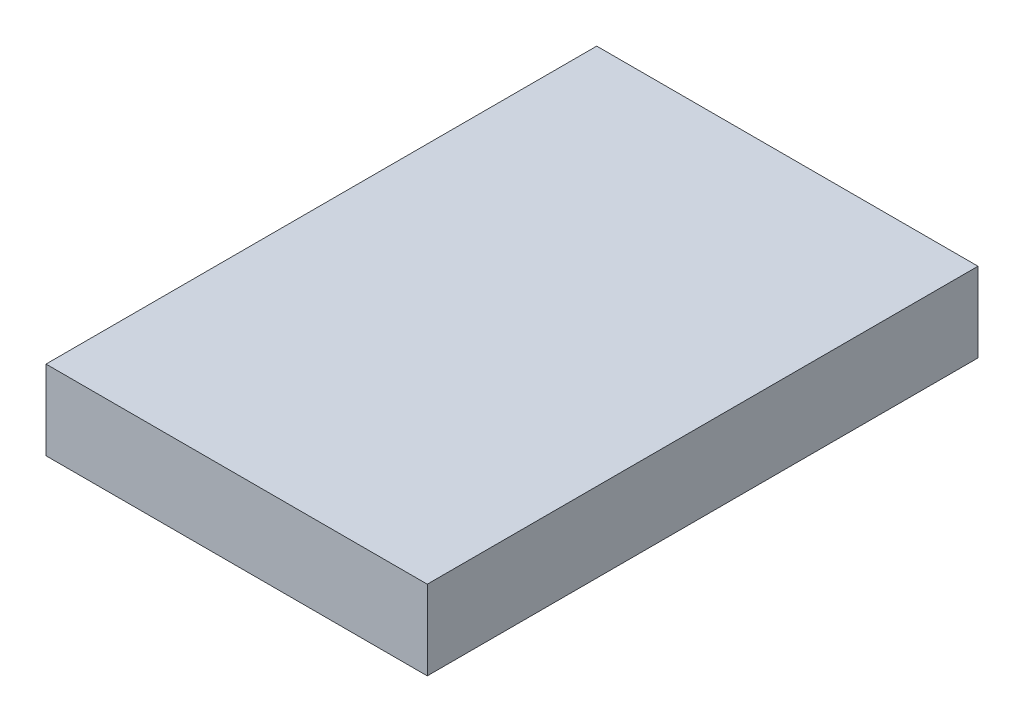
ISO-10303-21;
HEADER;
FILE_DESCRIPTION(('STEP AP214'),'2;1');
FILE_NAME('part.step','',(''),(''),'','','');
FILE_SCHEMA(('AUTOMOTIVE_DESIGN { 1 0 10303 214 1 1 1 1 }'));
ENDSEC;
DATA;
#1=APPLICATION_CONTEXT('core data for automotive mechanical design processes');
#2=APPLICATION_PROTOCOL_DEFINITION('international standard','automotive_design',2000,#1);
#3=PRODUCT_CONTEXT('',#1,'mechanical');
#4=PRODUCT('Part','Part','',(#3));
#5=PRODUCT_RELATED_PRODUCT_CATEGORY('part','',(#4));
#6=PRODUCT_DEFINITION_FORMATION('','',#4);
#7=PRODUCT_DEFINITION_CONTEXT('part definition',#1,'design');
#8=PRODUCT_DEFINITION('design','',#6,#7);
#9=PRODUCT_DEFINITION_SHAPE('','',#8);
#10=(LENGTH_UNIT() NAMED_UNIT(*) SI_UNIT(.MILLI.,.METRE.));
#11=(NAMED_UNIT(*) PLANE_ANGLE_UNIT() SI_UNIT($,.RADIAN.));
#12=(NAMED_UNIT(*) SI_UNIT($,.STERADIAN.) SOLID_ANGLE_UNIT());
#13=UNCERTAINTY_MEASURE_WITH_UNIT(LENGTH_MEASURE(1.E-05),#10,'distance_accuracy_value','');
#14=(GEOMETRIC_REPRESENTATION_CONTEXT(3) GLOBAL_UNCERTAINTY_ASSIGNED_CONTEXT((#13)) GLOBAL_UNIT_ASSIGNED_CONTEXT((#10,
#11,#12)) REPRESENTATION_CONTEXT('',''));
#15=CARTESIAN_POINT('',(0.,0.,0.));
#16=DIRECTION('',(0.,0.,1.));
#17=DIRECTION('',(1.,0.,0.));
#18=AXIS2_PLACEMENT_3D('',#15,#16,#17);
#19=CARTESIAN_POINT('',(-7.19999068,-1.499997,0.));
#20=DIRECTION('',(0.,1.,0.));
#21=DIRECTION('',(0.,0.,1.));
#22=AXIS2_PLACEMENT_3D('',#19,#20,#21);
#23=PLANE('',#22);
#24=DIRECTION('',(0.,0.,1.));
#25=VECTOR('',#24,1.);
#26=CARTESIAN_POINT('',(7.19999322,-1.499997,0.));
#27=LINE('',#26,#25);
#28=CARTESIAN_POINT('',(7.19999322,-1.499997,0.));
#29=VERTEX_POINT('',#28);
#30=CARTESIAN_POINT('',(7.19999322,-1.499997,20.79999904));
#31=VERTEX_POINT('',#30);
#32=EDGE_CURVE('E20',#29,#31,#27,.T.);
#33=ORIENTED_EDGE('',*,*,#32,.T.);
#34=DIRECTION('',(-1.,0.,0.));
#35=VECTOR('',#34,1.);
#36=CARTESIAN_POINT('',(7.19999322,-1.499997,20.79999904));
#37=LINE('',#36,#35);
#38=CARTESIAN_POINT('',(-7.19999068000001,-1.499997,20.79999904));
#39=VERTEX_POINT('',#38);
#40=EDGE_CURVE('E55',#31,#39,#37,.T.);
#41=ORIENTED_EDGE('',*,*,#40,.T.);
#42=DIRECTION('',(0.,0.,1.));
#43=VECTOR('',#42,1.);
#44=CARTESIAN_POINT('',(-7.19999068000003,-1.499997,0.));
#45=LINE('',#44,#43);
#46=CARTESIAN_POINT('',(-7.19999068000001,-1.499997,0.));
#47=VERTEX_POINT('',#46);
#48=EDGE_CURVE('E74',#39,#47,#45,.F.);
#49=ORIENTED_EDGE('',*,*,#48,.T.);
#50=DIRECTION('',(-1.,0.,0.));
#51=VECTOR('',#50,1.);
#52=CARTESIAN_POINT('',(7.19999322,-1.499997,0.));
#53=LINE('',#52,#51);
#54=EDGE_CURVE('E66',#29,#47,#53,.T.);
#55=ORIENTED_EDGE('',*,*,#54,.F.);
#56=EDGE_LOOP('',(#33,#41,#49,#55));
#57=FACE_BOUND('',#56,.T.);
#58=ADVANCED_FACE('F17',(#57),#23,.F.);
#59=CARTESIAN_POINT('',(7.19999322,-1.499997,0.));
#60=DIRECTION('',(-1.,0.,0.));
#61=DIRECTION('',(0.,0.,1.));
#62=AXIS2_PLACEMENT_3D('',#59,#60,#61);
#63=PLANE('',#62);
#64=DIRECTION('',(0.,0.,-1.));
#65=VECTOR('',#64,1.);
#66=CARTESIAN_POINT('',(7.19999322,1.49999954,0.));
#67=LINE('',#66,#65);
#68=CARTESIAN_POINT('',(7.19999322,1.49999954,0.));
#69=VERTEX_POINT('',#68);
#70=CARTESIAN_POINT('',(7.19999322,1.49999954,20.79999904));
#71=VERTEX_POINT('',#70);
#72=EDGE_CURVE('E72',#69,#71,#67,.F.);
#73=ORIENTED_EDGE('',*,*,#72,.T.);
#74=DIRECTION('',(0.,1.,0.));
#75=VECTOR('',#74,1.);
#76=CARTESIAN_POINT('',(7.19999322,-1.499997,20.79999904));
#77=LINE('',#76,#75);
#78=EDGE_CURVE('E62',#71,#31,#77,.F.);
#79=ORIENTED_EDGE('',*,*,#78,.T.);
#80=ORIENTED_EDGE('',*,*,#32,.F.);
#81=DIRECTION('',(0.,1.,0.));
#82=VECTOR('',#81,1.);
#83=CARTESIAN_POINT('',(7.19999322,-1.499997,0.));
#84=LINE('',#83,#82);
#85=EDGE_CURVE('E80',#69,#29,#84,.F.);
#86=ORIENTED_EDGE('',*,*,#85,.F.);
#87=EDGE_LOOP('',(#73,#79,#80,#86));
#88=FACE_BOUND('',#87,.T.);
#89=ADVANCED_FACE('F71',(#88),#63,.F.);
#90=CARTESIAN_POINT('',(7.19999322,-1.499997,20.79999904));
#91=DIRECTION('',(0.,0.,-1.));
#92=DIRECTION('',(-1.,0.,0.));
#93=AXIS2_PLACEMENT_3D('',#90,#91,#92);
#94=PLANE('',#93);
#95=DIRECTION('',(1.,0.,0.));
#96=VECTOR('',#95,1.);
#97=CARTESIAN_POINT('',(7.19999322,1.49999954,20.79999904));
#98=LINE('',#97,#96);
#99=CARTESIAN_POINT('',(-7.19999195,1.49999954,20.79999904));
#100=VERTEX_POINT('',#99);
#101=EDGE_CURVE('E83',#71,#100,#98,.F.);
#102=ORIENTED_EDGE('',*,*,#101,.T.);
#103=DIRECTION('',(-8.46667632681097E-07,0.999999999999642,0.));
#104=VECTOR('',#103,1.);
#105=CARTESIAN_POINT('',(-7.19999322,1.49999954,20.79999904));
#106=LINE('',#105,#104);
#107=EDGE_CURVE('E64',#100,#39,#106,.F.);
#108=ORIENTED_EDGE('',*,*,#107,.T.);
#109=ORIENTED_EDGE('',*,*,#40,.F.);
#110=ORIENTED_EDGE('',*,*,#78,.F.);
#111=EDGE_LOOP('',(#102,#108,#109,#110));
#112=FACE_BOUND('',#111,.T.);
#113=ADVANCED_FACE('F60',(#112),#94,.F.);
#114=CARTESIAN_POINT('',(-7.19999322,1.49999954,0.));
#115=DIRECTION('',(0.999999999999642,8.46667632681097E-07,0.));
#116=DIRECTION('',(-8.46667632681097E-07,0.999999999999642,0.));
#117=AXIS2_PLACEMENT_3D('',#114,#115,#116);
#118=PLANE('',#117);
#119=ORIENTED_EDGE('',*,*,#48,.F.);
#120=ORIENTED_EDGE('',*,*,#107,.F.);
#121=DIRECTION('',(0.,0.,-1.));
#122=VECTOR('',#121,1.);
#123=CARTESIAN_POINT('',(-7.19999322,1.49999954,0.));
#124=LINE('',#123,#122);
#125=CARTESIAN_POINT('',(-7.199992585,1.49999954,0.));
#126=VERTEX_POINT('',#125);
#127=EDGE_CURVE('E26',#100,#126,#124,.T.);
#128=ORIENTED_EDGE('',*,*,#127,.T.);
#129=DIRECTION('',(0.,1.,0.));
#130=VECTOR('',#129,1.);
#131=CARTESIAN_POINT('',(-7.19999068,-1.499997,0.));
#132=LINE('',#131,#130);
#133=EDGE_CURVE('E34',#47,#126,#132,.T.);
#134=ORIENTED_EDGE('',*,*,#133,.F.);
#135=EDGE_LOOP('',(#119,#120,#128,#134));
#136=FACE_BOUND('',#135,.T.);
#137=ADVANCED_FACE('F88',(#136),#118,.F.);
#138=CARTESIAN_POINT('',(7.19999322,-1.499997,0.));
#139=DIRECTION('',(0.,0.,-1.));
#140=DIRECTION('',(-1.,0.,0.));
#141=AXIS2_PLACEMENT_3D('',#138,#139,#140);
#142=PLANE('',#141);
#143=DIRECTION('',(1.,0.,0.));
#144=VECTOR('',#143,1.);
#145=CARTESIAN_POINT('',(7.19999322,1.49999954,0.));
#146=LINE('',#145,#144);
#147=EDGE_CURVE('E11',#126,#69,#146,.T.);
#148=ORIENTED_EDGE('',*,*,#147,.T.);
#149=ORIENTED_EDGE('',*,*,#85,.T.);
#150=ORIENTED_EDGE('',*,*,#54,.T.);
#151=ORIENTED_EDGE('',*,*,#133,.T.);
#152=EDGE_LOOP('',(#148,#149,#150,#151));
#153=FACE_BOUND('',#152,.T.);
#154=ADVANCED_FACE('F91',(#153),#142,.T.);
#155=CARTESIAN_POINT('',(7.19999322,1.49999954,0.));
#156=DIRECTION('',(0.,-1.,0.));
#157=DIRECTION('',(0.,0.,-1.));
#158=AXIS2_PLACEMENT_3D('',#155,#156,#157);
#159=PLANE('',#158);
#160=ORIENTED_EDGE('',*,*,#127,.F.);
#161=ORIENTED_EDGE('',*,*,#101,.F.);
#162=ORIENTED_EDGE('',*,*,#72,.F.);
#163=ORIENTED_EDGE('',*,*,#147,.F.);
#164=EDGE_LOOP('',(#160,#161,#162,#163));
#165=FACE_BOUND('',#164,.T.);
#166=ADVANCED_FACE('F90',(#165),#159,.F.);
#167=CLOSED_SHELL('',(#58,#89,#113,#137,#154,#166));
#168=MANIFOLD_SOLID_BREP('B1',#167);
#169=ADVANCED_BREP_SHAPE_REPRESENTATION('',(#18,#168),#14);
#170=SHAPE_DEFINITION_REPRESENTATION(#9,#169);
ENDSEC;
END-ISO-10303-21;
